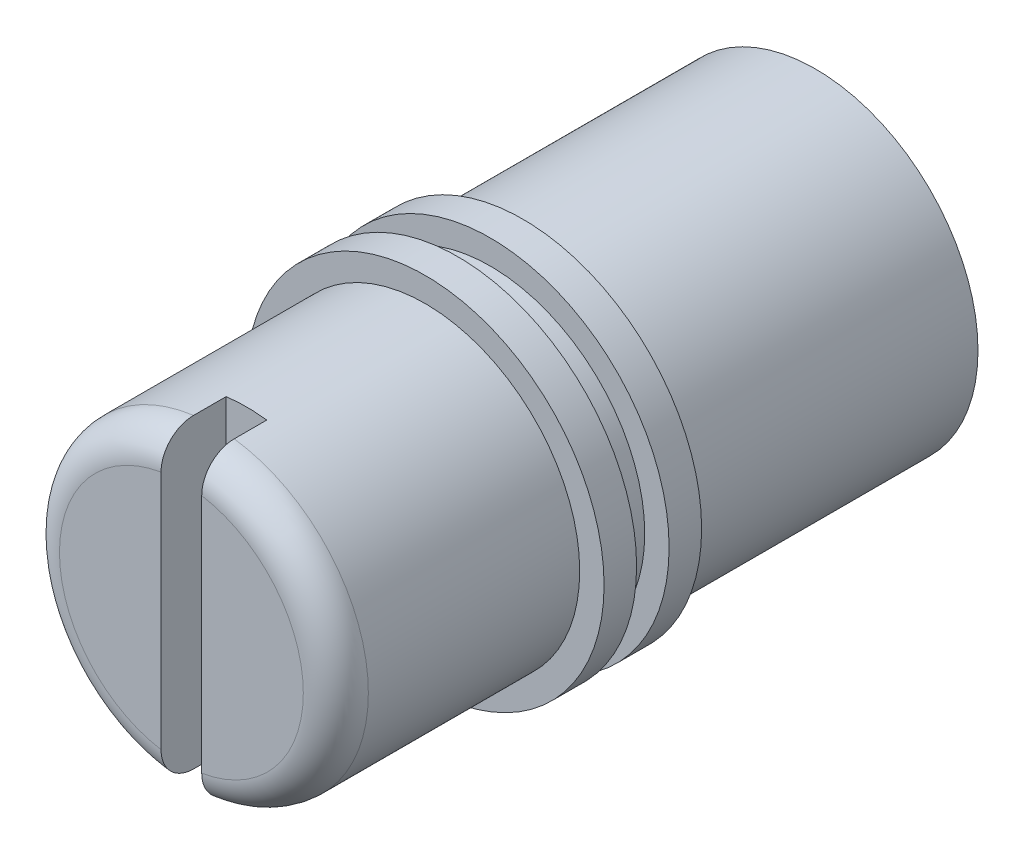
ISO-10303-21;
HEADER;
FILE_DESCRIPTION(('STEP AP214'),'2;1');
FILE_NAME('part.step','',(''),(''),'','','');
FILE_SCHEMA(('AUTOMOTIVE_DESIGN { 1 0 10303 214 1 1 1 1 }'));
ENDSEC;
DATA;
#1=APPLICATION_CONTEXT('core data for automotive mechanical design processes');
#2=APPLICATION_PROTOCOL_DEFINITION('international standard','automotive_design',2000,#1);
#3=PRODUCT_CONTEXT('',#1,'mechanical');
#4=PRODUCT('Part','Part','',(#3));
#5=PRODUCT_RELATED_PRODUCT_CATEGORY('part','',(#4));
#6=PRODUCT_DEFINITION_FORMATION('','',#4);
#7=PRODUCT_DEFINITION_CONTEXT('part definition',#1,'design');
#8=PRODUCT_DEFINITION('design','',#6,#7);
#9=PRODUCT_DEFINITION_SHAPE('','',#8);
#10=(LENGTH_UNIT() NAMED_UNIT(*) SI_UNIT(.MILLI.,.METRE.));
#11=(NAMED_UNIT(*) PLANE_ANGLE_UNIT() SI_UNIT($,.RADIAN.));
#12=(NAMED_UNIT(*) SI_UNIT($,.STERADIAN.) SOLID_ANGLE_UNIT());
#13=UNCERTAINTY_MEASURE_WITH_UNIT(LENGTH_MEASURE(1.E-05),#10,'distance_accuracy_value','');
#14=(GEOMETRIC_REPRESENTATION_CONTEXT(3) GLOBAL_UNCERTAINTY_ASSIGNED_CONTEXT((#13)) GLOBAL_UNIT_ASSIGNED_CONTEXT((#10,
#11,#12)) REPRESENTATION_CONTEXT('',''));
#15=CARTESIAN_POINT('',(0.,0.,0.));
#16=DIRECTION('',(0.,0.,1.));
#17=DIRECTION('',(1.,0.,0.));
#18=AXIS2_PLACEMENT_3D('',#15,#16,#17);
#19=CARTESIAN_POINT('',(0.,0.,19.));
#20=DIRECTION('',(0.,0.,1.));
#21=DIRECTION('',(1.,0.,0.));
#22=AXIS2_PLACEMENT_3D('',#19,#20,#21);
#23=PLANE('',#22);
#24=DIRECTION('',(0.,1.,0.));
#25=VECTOR('',#24,1.);
#26=CARTESIAN_POINT('',(1.25,-9.41740410091868,19.));
#27=LINE('',#26,#25);
#28=CARTESIAN_POINT('',(1.25,-7.39509972887452,19.));
#29=VERTEX_POINT('',#28);
#30=CARTESIAN_POINT('',(1.25,7.39509972887452,19.));
#31=VERTEX_POINT('',#30);
#32=EDGE_CURVE('E118',#29,#31,#27,.T.);
#33=ORIENTED_EDGE('',*,*,#32,.F.);
#34=CARTESIAN_POINT('',(0.,0.,19.));
#35=DIRECTION('',(0.,0.,1.));
#36=DIRECTION('',(1.,0.,0.));
#37=AXIS2_PLACEMENT_3D('',#34,#35,#36);
#38=CIRCLE('',#37,7.5);
#39=EDGE_CURVE('E172',#29,#31,#38,.T.);
#40=ORIENTED_EDGE('',*,*,#39,.T.);
#41=EDGE_LOOP('',(#33,#40));
#42=FACE_BOUND('',#41,.T.);
#43=ADVANCED_FACE('F45',(#42),#23,.T.);
#44=CARTESIAN_POINT('',(0.,0.,17.));
#45=DIRECTION('',(0.,0.,1.));
#46=DIRECTION('',(1.,0.,0.));
#47=AXIS2_PLACEMENT_3D('',#44,#45,#46);
#48=TOROIDAL_SURFACE('',#47,7.5,2.);
#49=CARTESIAN_POINT('',(1.25,-9.04664908810601,18.155258134867));
#50=CARTESIAN_POINT('',(1.25,-8.98093172830162,18.2472460076565));
#51=CARTESIAN_POINT('',(1.25,-8.90733675424601,18.3337135089591));
#52=CARTESIAN_POINT('',(1.25,-8.74657328319224,18.4930938455224));
#53=CARTESIAN_POINT('',(1.25,-8.65938716821143,18.5659888139272));
#54=CARTESIAN_POINT('',(1.25,-8.47411301046072,18.6960803828204));
#55=CARTESIAN_POINT('',(1.25,-8.37603510327227,18.7532914091491));
#56=CARTESIAN_POINT('',(1.25,-8.17175584555951,18.8505660053467));
#57=CARTESIAN_POINT('',(1.25,-8.06555649444125,18.8906337797702));
#58=CARTESIAN_POINT('',(1.25,-7.8471159196168,18.952886446735));
#59=CARTESIAN_POINT('',(1.25,-7.73483294010543,18.9749247825302));
#60=CARTESIAN_POINT('',(1.25,-7.50816237059739,19.0000602973961));
#61=CARTESIAN_POINT('',(1.25,-7.39377456464466,19.0031555219044));
#62=CARTESIAN_POINT('',(1.25,-7.16482038578324,18.9903233976251));
#63=CARTESIAN_POINT('',(1.25,-7.05026561450651,18.9741886850168));
#64=CARTESIAN_POINT('',(1.25,-6.8254466484228,18.9230447427116));
#65=CARTESIAN_POINT('',(1.25,-6.71518268555182,18.888034494229));
#66=CARTESIAN_POINT('',(1.25,-6.501361182468,18.7998275784157));
#67=CARTESIAN_POINT('',(1.25,-6.39785054200579,18.7465171283158));
#68=CARTESIAN_POINT('',(1.25,-6.20129186154907,18.6232053299459));
#69=CARTESIAN_POINT('',(1.25,-6.10824387390797,18.5532038981624));
#70=CARTESIAN_POINT('',(1.25,-5.9357659766892,18.3987427214742));
#71=CARTESIAN_POINT('',(1.25,-5.85627826897539,18.3143475716091));
#72=CARTESIAN_POINT('',(1.25,-5.71290765759123,18.1331991968593));
#73=CARTESIAN_POINT('',(1.25,-5.64902323955097,18.0364471726544));
#74=CARTESIAN_POINT('',(1.25,-5.53996371024852,17.8351609897139));
#75=CARTESIAN_POINT('',(1.25,-5.49447306423277,17.7307978904612));
#76=CARTESIAN_POINT('',(1.25,-5.42213536140043,17.5158003686838));
#77=CARTESIAN_POINT('',(1.25,-5.39528527424443,17.4051669686675));
#78=CARTESIAN_POINT('',(1.25,-5.36157994148869,17.1835306791256));
#79=CARTESIAN_POINT('',(1.25,-5.35427466716089,17.072596085358));
#80=CARTESIAN_POINT('',(1.25,-5.35861531443613,16.8511036212777));
#81=CARTESIAN_POINT('',(1.25,-5.37025976944812,16.7405457224747));
#82=CARTESIAN_POINT('',(1.25,-5.41186577089052,16.5241592644766));
#83=CARTESIAN_POINT('',(1.25,-5.44163196887986,16.4182930121334));
#84=CARTESIAN_POINT('',(1.25,-5.51832130049649,16.2129746784932));
#85=CARTESIAN_POINT('',(1.25,-5.56524527705612,16.1135229126115));
#86=CARTESIAN_POINT('',(1.25,-5.67538800403309,15.9226091243763));
#87=CARTESIAN_POINT('',(1.25,-5.73878367100242,15.8312492643372));
#88=CARTESIAN_POINT('',(1.25,-5.87969082488002,15.6601588923238));
#89=CARTESIAN_POINT('',(1.25,-5.95720391215034,15.5804297006588));
#90=CARTESIAN_POINT('',(1.25,-6.12605730948198,15.4329319963659));
#91=CARTESIAN_POINT('',(1.25,-6.21767412899147,15.3654799764408));
#92=CARTESIAN_POINT('',(1.25,-6.41076735727536,15.2465876676371));
#93=CARTESIAN_POINT('',(1.25,-6.51224476265973,15.195148999442));
#94=CARTESIAN_POINT('',(1.25,-6.72416708152035,15.1088487629196));
#95=CARTESIAN_POINT('',(1.25,-6.83474079043553,15.0743031475377));
#96=CARTESIAN_POINT('',(1.25,-7.0601068444,15.0241580274368));
#97=CARTESIAN_POINT('',(1.25,-7.17489936225265,15.0085592996796));
#98=CARTESIAN_POINT('',(1.25,-7.40606369959346,14.9967625517364));
#99=CARTESIAN_POINT('',(1.25,-7.52244056328628,15.0006627276469));
#100=CARTESIAN_POINT('',(1.25,-7.75286647219451,15.0280647417085));
#101=CARTESIAN_POINT('',(1.25,-7.86691556786574,15.0515661545274));
#102=CARTESIAN_POINT('',(1.25,-8.08871315343761,15.1174003493541));
#103=CARTESIAN_POINT('',(1.25,-8.19649487210649,15.1596211108351));
#104=CARTESIAN_POINT('',(1.25,-8.40332569496314,15.2617535571945));
#105=CARTESIAN_POINT('',(1.25,-8.50237525497466,15.3216643179339));
#106=CARTESIAN_POINT('',(1.25,-8.68777505066659,15.4567814748473));
#107=CARTESIAN_POINT('',(1.25,-8.77425172250068,15.5318143745134));
#108=CARTESIAN_POINT('',(1.25,-8.93320844101848,15.6954766645595));
#109=CARTESIAN_POINT('',(1.25,-9.00568929518517,15.784105270011));
#110=CARTESIAN_POINT('',(1.25,-9.13377696044264,15.9714059655306));
#111=CARTESIAN_POINT('',(1.25,-9.18955775838269,16.0699590910185));
#112=CARTESIAN_POINT('',(1.25,-9.28362684527791,16.2750827795306));
#113=CARTESIAN_POINT('',(1.25,-9.32191666524692,16.3816526398855));
#114=CARTESIAN_POINT('',(1.25,-9.37962592169814,16.5988665056513));
#115=CARTESIAN_POINT('',(1.25,-9.39919423910013,16.7094709807697));
#116=CARTESIAN_POINT('',(1.25,-9.41941099859594,16.9324259897071));
#117=CARTESIAN_POINT('',(1.25,-9.42005514052417,17.0447769145714));
#118=CARTESIAN_POINT('',(1.25,-9.40242919940757,17.267607470661));
#119=CARTESIAN_POINT('',(1.25,-9.38422003609745,17.3780919639246));
#120=CARTESIAN_POINT('',(1.25,-9.32952587826011,17.5943397566418));
#121=CARTESIAN_POINT('',(1.25,-9.29306346031533,17.7001087129524));
#122=CARTESIAN_POINT('',(1.25,-9.22061942769984,17.8641322566973));
#123=CARTESIAN_POINT('',(1.25,-9.19000689817255,17.9248166366184));
#124=CARTESIAN_POINT('',(1.25,-9.12276013648806,18.0427507206054));
#125=CARTESIAN_POINT('',(1.25,-9.08612592343863,18.1000004355692));
#126=CARTESIAN_POINT('',(1.25,-9.04664908810601,18.155258134867));
#127=B_SPLINE_CURVE_WITH_KNOTS('',3,(#49,#50,#51,#52,#53,#54,#55,#56,#57,#58,#59,#60,#61,#62,
#63,#64,#65,#66,#67,#68,#69,#70,#71,#72,#73,#74,#75,#76,#77,#78,#79,#80,#81,#82,#83,#84,#85,#86,
#87,#88,#89,#90,#91,#92,#93,#94,#95,#96,#97,#98,#99,#100,#101,#102,#103,#104,#105,#106,#107,
#108,#109,#110,#111,#112,#113,#114,#115,#116,#117,#118,#119,#120,#121,#122,#123,#124,#125,#126),
.UNSPECIFIED.,.T.,.F.,(4,2,2,2,2,2,2,2,2,2,2,2,2,2,2,2,2,2,2,2,2,2,2,2,2,2,2,2,2,2,2,2,2,2,2,2,
2,2,4),(0.,0.338902148739581,0.67824732127074,1.01727931422795,1.35622810845693,
1.69790549636849,2.03961813817965,2.38504918325568,2.73049887444831,3.07813653861252,
3.42577594222186,3.77189442232045,4.11797929669302,4.4578459088352,4.79765725694145,
5.12957410319627,5.46146526237564,5.78984054031466,6.11823195293831,6.45030783908038,
6.78242139306759,7.12215698616986,7.46192695215374,7.80782935031775,8.15374593254628,
8.50140629335011,8.84905911037985,9.19465900440553,9.54024084722132,9.88206300745838,
10.2238654405094,10.5619719113039,10.900048781414,11.2354142146416,11.5708558528136,
11.9052169678543,12.2391655455459,12.4427468642696,12.6463275370094),.UNSPECIFIED.);
#128=CARTESIAN_POINT('',(1.25,-9.41740410091868,17.));
#129=VERTEX_POINT('',#128);
#130=EDGE_CURVE('E11',#129,#29,#127,.T.);
#131=ORIENTED_EDGE('',*,*,#130,.F.);
#132=CARTESIAN_POINT('',(0.,0.,17.));
#133=DIRECTION('',(0.,0.,1.));
#134=DIRECTION('',(1.,0.,0.));
#135=AXIS2_PLACEMENT_3D('',#132,#133,#134);
#136=CIRCLE('',#135,9.5);
#137=CARTESIAN_POINT('',(1.25,9.41740410091868,17.));
#138=VERTEX_POINT('',#137);
#139=EDGE_CURVE('E177',#138,#129,#136,.F.);
#140=ORIENTED_EDGE('',*,*,#139,.F.);
#141=CARTESIAN_POINT('',(1.25,5.55984293893053,17.8689398843067));
#142=CARTESIAN_POINT('',(1.25,5.61015144852526,17.9706806387738));
#143=CARTESIAN_POINT('',(1.25,5.66924840118999,18.0681803413833));
#144=CARTESIAN_POINT('',(1.25,5.80310528793279,18.2518959953369));
#145=CARTESIAN_POINT('',(1.25,5.87788845789628,18.338094895576));
#146=CARTESIAN_POINT('',(1.25,6.04068321464192,18.4966902948045));
#147=CARTESIAN_POINT('',(1.25,6.12867626562556,18.569105816433));
#148=CARTESIAN_POINT('',(1.25,6.31538884745695,18.6983686078277));
#149=CARTESIAN_POINT('',(1.25,6.4141055200743,18.7552200118387));
#150=CARTESIAN_POINT('',(1.25,6.62104635391127,18.8526211519308));
#151=CARTESIAN_POINT('',(1.25,6.72938819056522,18.8929210131031));
#152=CARTESIAN_POINT('',(1.25,6.95127957045933,18.9549126880543));
#153=CARTESIAN_POINT('',(1.25,7.06482962433838,18.9766026731045));
#154=CARTESIAN_POINT('',(1.25,7.29478882675318,19.0008211943336));
#155=CARTESIAN_POINT('',(1.25,7.41121267761593,19.0032105914684));
#156=CARTESIAN_POINT('',(1.25,7.64279862252071,18.9883183881906));
#157=CARTESIAN_POINT('',(1.25,7.75796073410363,18.9710370615945));
#158=CARTESIAN_POINT('',(1.25,7.98318112492996,18.9173237284002));
#159=CARTESIAN_POINT('',(1.25,8.09326017132482,18.8809788766639));
#160=CARTESIAN_POINT('',(1.25,8.30565392314418,18.7901307469127));
#161=CARTESIAN_POINT('',(1.25,8.40796904319875,18.7356284394302));
#162=CARTESIAN_POINT('',(1.25,8.60077924199814,18.6106155459844));
#163=CARTESIAN_POINT('',(1.25,8.69138689602422,18.5402786038901));
#164=CARTESIAN_POINT('',(1.25,8.85933939810479,18.3852350362491));
#165=CARTESIAN_POINT('',(1.25,8.93668502611996,18.3005292563397));
#166=CARTESIAN_POINT('',(1.25,9.07501638234029,18.1201681803661));
#167=CARTESIAN_POINT('',(1.25,9.13617395742325,18.0246446693298));
#168=CARTESIAN_POINT('',(1.25,9.24142337380422,17.8246176627828));
#169=CARTESIAN_POINT('',(1.25,9.28551607932205,17.7201146223519));
#170=CARTESIAN_POINT('',(1.25,9.35501428477004,17.5060533973718));
#171=CARTESIAN_POINT('',(1.25,9.38057540100308,17.3965457169454));
#172=CARTESIAN_POINT('',(1.25,9.41285918941374,17.1747885502003));
#173=CARTESIAN_POINT('',(1.25,9.41958243688374,17.0625391477172));
#174=CARTESIAN_POINT('',(1.25,9.41400349807255,16.8390134693709));
#175=CARTESIAN_POINT('',(1.25,9.40178533564099,16.7277350853021));
#176=CARTESIAN_POINT('',(1.25,9.35884166107459,16.5088104866349));
#177=CARTESIAN_POINT('',(1.25,9.32811629621285,16.4011642431406));
#178=CARTESIAN_POINT('',(1.25,9.2490570801149,16.1925275226135));
#179=CARTESIAN_POINT('',(1.25,9.20072036924745,16.0915381296293));
#180=CARTESIAN_POINT('',(1.25,9.08785381567853,15.8990576437733));
#181=CARTESIAN_POINT('',(1.25,9.02332372377377,15.8075666971057));
#182=CARTESIAN_POINT('',(1.25,8.87960126952886,15.6362019006753));
#183=CARTESIAN_POINT('',(1.25,8.80034154775554,15.5563845588965));
#184=CARTESIAN_POINT('',(1.25,8.62964758754415,15.4110535636598));
#185=CARTESIAN_POINT('',(1.25,8.53821289786071,15.3455404406021));
#186=CARTESIAN_POINT('',(1.25,8.34493341622261,15.2300580117029));
#187=CARTESIAN_POINT('',(1.25,8.24300574135702,15.1802274516952));
#188=CARTESIAN_POINT('',(1.25,8.03229563219479,15.0981754511769));
#189=CARTESIAN_POINT('',(1.25,7.92351281693563,15.0659549902814));
#190=CARTESIAN_POINT('',(1.25,7.70089973900283,15.0196592849016));
#191=CARTESIAN_POINT('',(1.25,7.58702703274839,15.0057881366748));
#192=CARTESIAN_POINT('',(1.25,7.35855929592549,14.9971480865757));
#193=CARTESIAN_POINT('',(1.25,7.24396422073139,15.0023803766296));
#194=CARTESIAN_POINT('',(1.25,7.01604212953403,15.0318930856472));
#195=CARTESIAN_POINT('',(1.25,6.90274059735973,15.0563705274503));
#196=CARTESIAN_POINT('',(1.25,6.68181360810447,15.1239082971533));
#197=CARTESIAN_POINT('',(1.25,6.57418844438509,15.1669695844348));
#198=CARTESIAN_POINT('',(1.25,6.36719196484646,15.2707366052778));
#199=CARTESIAN_POINT('',(1.25,6.26786015654822,15.3315212144146));
#200=CARTESIAN_POINT('',(1.25,6.08090033263828,15.4690180456167));
#201=CARTESIAN_POINT('',(1.25,5.99327219916886,15.5457301072704));
#202=CARTESIAN_POINT('',(1.25,5.83298066764093,15.712378015008));
#203=CARTESIAN_POINT('',(1.25,5.76021214634013,15.8022126623509));
#204=CARTESIAN_POINT('',(1.25,5.63116161874592,15.9930316133278));
#205=CARTESIAN_POINT('',(1.25,5.57487693401569,16.0940141018879));
#206=CARTESIAN_POINT('',(1.25,5.48165650197311,16.302073488244));
#207=CARTESIAN_POINT('',(1.25,5.44434910886573,16.4089838249687));
#208=CARTESIAN_POINT('',(1.25,5.38866344822197,16.6276555466492));
#209=CARTESIAN_POINT('',(1.25,5.37028717251242,16.7394174407699));
#210=CARTESIAN_POINT('',(1.25,5.35331461873287,16.9619897330401));
#211=CARTESIAN_POINT('',(1.25,5.35430038440092,17.0727686863209));
#212=CARTESIAN_POINT('',(1.25,5.3749996715628,17.2924624316921));
#213=CARTESIAN_POINT('',(1.25,5.39468881968732,17.4013794621313));
#214=CARTESIAN_POINT('',(1.25,5.44011237810177,17.5700397911123));
#215=CARTESIAN_POINT('',(1.25,5.45994851810567,17.6314346725764));
#216=CARTESIAN_POINT('',(1.25,5.50552564471524,17.7519890889681));
#217=CARTESIAN_POINT('',(1.25,5.53126648987385,17.8111486774027));
#218=CARTESIAN_POINT('',(1.25,5.55984293893053,17.8689398843067));
#219=B_SPLINE_CURVE_WITH_KNOTS('',3,(#141,#142,#143,#144,#145,#146,#147,#148,#149,#150,#151,
#152,#153,#154,#155,#156,#157,#158,#159,#160,#161,#162,#163,#164,#165,#166,#167,#168,#169,#170,
#171,#172,#173,#174,#175,#176,#177,#178,#179,#180,#181,#182,#183,#184,#185,#186,#187,#188,#189,
#190,#191,#192,#193,#194,#195,#196,#197,#198,#199,#200,#201,#202,#203,#204,#205,#206,#207,#208,
#209,#210,#211,#212,#213,#214,#215,#216,#217,#218),.UNSPECIFIED.,.T.,.F.,(4,2,2,2,2,2,2,2,2,2,2,
2,2,2,2,2,2,2,2,2,2,2,2,2,2,2,2,2,2,2,2,2,2,2,2,2,2,2,4),(0.,0.340256385407494,
0.681020395348954,1.02131064667565,1.36151041993966,1.70667241462045,2.05186832330097,
2.3995505678874,2.74722797279316,3.0933295409353,3.43941261260356,3.78187093121677,
4.12430910240242,4.46295131361893,4.80157637266142,5.13732385959273,5.47306109297125,
5.80731325643285,6.14156276008135,6.47586656148786,6.81017550787993,7.14605266753195,
7.48194227939139,7.82072504800352,8.15952666051196,8.50206587559499,8.84462646318858,
9.19074042430458,9.53687225551599,9.88456865149879,10.2322615458643,10.5774022955184,
10.9224869325528,11.2605247413714,11.5985981130162,11.9293818852288,12.2597351860656,
12.453013664105,12.6462875126475),.UNSPECIFIED.);
#220=EDGE_CURVE('E59',#31,#138,#219,.T.);
#221=ORIENTED_EDGE('',*,*,#220,.F.);
#222=ORIENTED_EDGE('',*,*,#39,.F.);
#223=EDGE_LOOP('',(#131,#140,#221,#222));
#224=FACE_BOUND('',#223,.T.);
#225=ADVANCED_FACE('F240',(#224),#48,.T.);
#226=CARTESIAN_POINT('',(0.,0.,19.));
#227=DIRECTION('',(0.,0.,-1.));
#228=DIRECTION('',(-1.,0.,0.));
#229=AXIS2_PLACEMENT_3D('',#226,#227,#228);
#230=CYLINDRICAL_SURFACE('',#229,9.5);
#231=CARTESIAN_POINT('',(0.,0.,0.));
#232=DIRECTION('',(0.,0.,1.));
#233=DIRECTION('',(1.,0.,0.));
#234=AXIS2_PLACEMENT_3D('',#231,#232,#233);
#235=CIRCLE('',#234,9.5);
#236=CARTESIAN_POINT('',(9.5,0.,0.));
#237=VERTEX_POINT('',#236);
#238=EDGE_CURVE('E164',#237,#237,#235,.T.);
#239=ORIENTED_EDGE('',*,*,#238,.T.);
#240=EDGE_LOOP('',(#239));
#241=FACE_BOUND('',#240,.T.);
#242=CARTESIAN_POINT('',(0.,0.,2.));
#243=DIRECTION('',(0.,0.,1.));
#244=DIRECTION('',(1.,0.,0.));
#245=AXIS2_PLACEMENT_3D('',#242,#243,#244);
#246=CIRCLE('',#245,9.5);
#247=CARTESIAN_POINT('',(9.5,0.,2.));
#248=VERTEX_POINT('',#247);
#249=EDGE_CURVE('E168',#248,#248,#246,.T.);
#250=ORIENTED_EDGE('',*,*,#249,.F.);
#251=EDGE_LOOP('',(#250));
#252=FACE_BOUND('',#251,.T.);
#253=ADVANCED_FACE('F228',(#241,#252),#230,.T.);
#254=CARTESIAN_POINT('',(0.,0.,0.));
#255=DIRECTION('',(0.,0.,1.));
#256=DIRECTION('',(1.,0.,0.));
#257=AXIS2_PLACEMENT_3D('',#254,#255,#256);
#258=PLANE('',#257);
#259=ORIENTED_EDGE('',*,*,#238,.F.);
#260=EDGE_LOOP('',(#259));
#261=FACE_BOUND('',#260,.T.);
#262=CARTESIAN_POINT('',(0.,0.,0.));
#263=DIRECTION('',(0.,0.,1.));
#264=DIRECTION('',(1.,0.,0.));
#265=AXIS2_PLACEMENT_3D('',#262,#263,#264);
#266=CIRCLE('',#265,11.);
#267=CARTESIAN_POINT('',(11.,0.,0.));
#268=VERTEX_POINT('',#267);
#269=EDGE_CURVE('E140',#268,#268,#266,.T.);
#270=ORIENTED_EDGE('',*,*,#269,.T.);
#271=EDGE_LOOP('',(#270));
#272=FACE_BOUND('',#271,.T.);
#273=ADVANCED_FACE('F220',(#261,#272),#258,.T.);
#274=CARTESIAN_POINT('',(0.,0.,4.));
#275=DIRECTION('',(0.,0.,-1.));
#276=DIRECTION('',(-1.,0.,0.));
#277=AXIS2_PLACEMENT_3D('',#274,#275,#276);
#278=CYLINDRICAL_SURFACE('',#277,11.);
#279=CARTESIAN_POINT('',(0.,0.,4.));
#280=DIRECTION('',(0.,0.,1.));
#281=DIRECTION('',(1.,0.,0.));
#282=AXIS2_PLACEMENT_3D('',#279,#280,#281);
#283=CIRCLE('',#282,11.);
#284=CARTESIAN_POINT('',(11.,0.,4.));
#285=VERTEX_POINT('',#284);
#286=EDGE_CURVE('E149',#285,#285,#283,.T.);
#287=ORIENTED_EDGE('',*,*,#286,.F.);
#288=EDGE_LOOP('',(#287));
#289=FACE_BOUND('',#288,.T.);
#290=CARTESIAN_POINT('',(0.,0.,2.));
#291=DIRECTION('',(0.,0.,1.));
#292=DIRECTION('',(1.,0.,0.));
#293=AXIS2_PLACEMENT_3D('',#290,#291,#292);
#294=CIRCLE('',#293,11.);
#295=CARTESIAN_POINT('',(11.,0.,2.));
#296=VERTEX_POINT('',#295);
#297=EDGE_CURVE('E144',#296,#296,#294,.T.);
#298=ORIENTED_EDGE('',*,*,#297,.T.);
#299=EDGE_LOOP('',(#298));
#300=FACE_BOUND('',#299,.T.);
#301=ADVANCED_FACE('F212',(#289,#300),#278,.T.);
#302=CARTESIAN_POINT('',(0.,0.,4.));
#303=DIRECTION('',(0.,0.,1.));
#304=DIRECTION('',(1.,0.,0.));
#305=AXIS2_PLACEMENT_3D('',#302,#303,#304);
#306=PLANE('',#305);
#307=ORIENTED_EDGE('',*,*,#286,.T.);
#308=EDGE_LOOP('',(#307));
#309=FACE_BOUND('',#308,.T.);
#310=CARTESIAN_POINT('',(0.,0.,4.));
#311=DIRECTION('',(0.,0.,1.));
#312=DIRECTION('',(1.,0.,0.));
#313=AXIS2_PLACEMENT_3D('',#310,#311,#312);
#314=CIRCLE('',#313,9.5);
#315=CARTESIAN_POINT('',(9.5,0.,4.));
#316=VERTEX_POINT('',#315);
#317=EDGE_CURVE('E153',#316,#316,#314,.T.);
#318=ORIENTED_EDGE('',*,*,#317,.F.);
#319=EDGE_LOOP('',(#318));
#320=FACE_BOUND('',#319,.T.);
#321=ADVANCED_FACE('F208',(#309,#320),#306,.T.);
#322=CARTESIAN_POINT('',(0.,0.,2.));
#323=DIRECTION('',(0.,0.,1.));
#324=DIRECTION('',(1.,0.,0.));
#325=AXIS2_PLACEMENT_3D('',#322,#323,#324);
#326=PLANE('',#325);
#327=ORIENTED_EDGE('',*,*,#297,.F.);
#328=EDGE_LOOP('',(#327));
#329=FACE_BOUND('',#328,.T.);
#330=ORIENTED_EDGE('',*,*,#249,.T.);
#331=EDGE_LOOP('',(#330));
#332=FACE_BOUND('',#331,.T.);
#333=ADVANCED_FACE('F211',(#329,#332),#326,.F.);
#334=DIRECTION('',(0.,-1.,0.));
#335=VECTOR('',#334,1.);
#336=CARTESIAN_POINT('',(-1.25,-9.41740410091868,19.));
#337=LINE('',#336,#335);
#338=CARTESIAN_POINT('',(-1.25,7.39509972887452,19.));
#339=VERTEX_POINT('',#338);
#340=CARTESIAN_POINT('',(-1.25,-7.39509972887452,19.));
#341=VERTEX_POINT('',#340);
#342=EDGE_CURVE('E251',#339,#341,#337,.T.);
#343=ORIENTED_EDGE('',*,*,#342,.F.);
#344=EDGE_CURVE('E176',#339,#341,#38,.T.);
#345=ORIENTED_EDGE('',*,*,#344,.T.);
#346=EDGE_LOOP('',(#343,#345));
#347=FACE_BOUND('',#346,.T.);
#348=ADVANCED_FACE('F216',(#347),#23,.T.);
#349=CARTESIAN_POINT('',(0.,0.,15.));
#350=DIRECTION('',(0.,0.,1.));
#351=DIRECTION('',(1.,0.,0.));
#352=AXIS2_PLACEMENT_3D('',#349,#350,#351);
#353=CIRCLE('',#352,9.5);
#354=CARTESIAN_POINT('',(1.25,9.41740410091868,15.));
#355=VERTEX_POINT('',#354);
#356=CARTESIAN_POINT('',(-1.25,9.41740410091868,15.));
#357=VERTEX_POINT('',#356);
#358=EDGE_CURVE('E109',#355,#357,#353,.T.);
#359=ORIENTED_EDGE('',*,*,#358,.F.);
#360=DIRECTION('',(0.,0.,1.));
#361=VECTOR('',#360,1.);
#362=CARTESIAN_POINT('',(1.25,9.41740410091868,15.));
#363=LINE('',#362,#361);
#364=EDGE_CURVE('E148',#355,#138,#363,.T.);
#365=ORIENTED_EDGE('',*,*,#364,.T.);
#366=ORIENTED_EDGE('',*,*,#139,.T.);
#367=DIRECTION('',(0.,0.,1.));
#368=VECTOR('',#367,1.);
#369=CARTESIAN_POINT('',(1.25,-9.41740410091868,15.));
#370=LINE('',#369,#368);
#371=CARTESIAN_POINT('',(1.25,-9.41740410091868,15.));
#372=VERTEX_POINT('',#371);
#373=EDGE_CURVE('E130',#372,#129,#370,.T.);
#374=ORIENTED_EDGE('',*,*,#373,.F.);
#375=CARTESIAN_POINT('',(0.,0.,15.));
#376=DIRECTION('',(0.,0.,1.));
#377=DIRECTION('',(1.,0.,0.));
#378=AXIS2_PLACEMENT_3D('',#375,#376,#377);
#379=CIRCLE('',#378,9.5);
#380=CARTESIAN_POINT('',(-1.25,-9.41740410091868,15.));
#381=VERTEX_POINT('',#380);
#382=EDGE_CURVE('E108',#381,#372,#379,.T.);
#383=ORIENTED_EDGE('',*,*,#382,.F.);
#384=DIRECTION('',(0.,0.,1.));
#385=VECTOR('',#384,1.);
#386=CARTESIAN_POINT('',(-1.25,-9.41740410091868,15.));
#387=LINE('',#386,#385);
#388=CARTESIAN_POINT('',(-1.25,-9.41740410091868,17.));
#389=VERTEX_POINT('',#388);
#390=EDGE_CURVE('E104',#381,#389,#387,.T.);
#391=ORIENTED_EDGE('',*,*,#390,.T.);
#392=CARTESIAN_POINT('',(-1.25,9.41740410091868,17.));
#393=VERTEX_POINT('',#392);
#394=EDGE_CURVE('E124',#389,#393,#136,.F.);
#395=ORIENTED_EDGE('',*,*,#394,.T.);
#396=DIRECTION('',(0.,0.,1.));
#397=VECTOR('',#396,1.);
#398=CARTESIAN_POINT('',(-1.25,9.41740410091868,15.));
#399=LINE('',#398,#397);
#400=EDGE_CURVE('E66',#357,#393,#399,.T.);
#401=ORIENTED_EDGE('',*,*,#400,.F.);
#402=EDGE_LOOP('',(#359,#365,#366,#374,#383,#391,#395,#401));
#403=FACE_BOUND('',#402,.T.);
#404=ORIENTED_EDGE('',*,*,#317,.T.);
#405=EDGE_LOOP('',(#404));
#406=FACE_BOUND('',#405,.T.);
#407=ADVANCED_FACE('F121',(#403,#406),#230,.T.);
#408=CARTESIAN_POINT('',(0.,0.,-2.));
#409=DIRECTION('',(0.,0.,1.));
#410=DIRECTION('',(1.,0.,0.));
#411=AXIS2_PLACEMENT_3D('',#408,#409,#410);
#412=CYLINDRICAL_SURFACE('',#411,11.);
#413=CARTESIAN_POINT('',(0.,0.,-2.));
#414=DIRECTION('',(0.,0.,1.));
#415=DIRECTION('',(1.,0.,0.));
#416=AXIS2_PLACEMENT_3D('',#413,#414,#415);
#417=CIRCLE('',#416,11.);
#418=CARTESIAN_POINT('',(11.,0.,-2.));
#419=VERTEX_POINT('',#418);
#420=EDGE_CURVE('E139',#419,#419,#417,.T.);
#421=ORIENTED_EDGE('',*,*,#420,.T.);
#422=EDGE_LOOP('',(#421));
#423=FACE_BOUND('',#422,.T.);
#424=ORIENTED_EDGE('',*,*,#269,.F.);
#425=EDGE_LOOP('',(#424));
#426=FACE_BOUND('',#425,.T.);
#427=ADVANCED_FACE('F203',(#423,#426),#412,.T.);
#428=CARTESIAN_POINT('',(0.,0.,-2.));
#429=DIRECTION('',(0.,0.,1.));
#430=DIRECTION('',(1.,0.,0.));
#431=AXIS2_PLACEMENT_3D('',#428,#429,#430);
#432=PLANE('',#431);
#433=CARTESIAN_POINT('',(0.,0.,-2.));
#434=DIRECTION('',(0.,0.,1.));
#435=DIRECTION('',(1.,0.,0.));
#436=AXIS2_PLACEMENT_3D('',#433,#434,#435);
#437=CIRCLE('',#436,10.);
#438=CARTESIAN_POINT('',(10.,0.,-2.));
#439=VERTEX_POINT('',#438);
#440=EDGE_CURVE('E135',#439,#439,#437,.T.);
#441=ORIENTED_EDGE('',*,*,#440,.T.);
#442=EDGE_LOOP('',(#441));
#443=FACE_BOUND('',#442,.T.);
#444=ORIENTED_EDGE('',*,*,#420,.F.);
#445=EDGE_LOOP('',(#444));
#446=FACE_BOUND('',#445,.T.);
#447=ADVANCED_FACE('F198',(#443,#446),#432,.F.);
#448=CARTESIAN_POINT('',(0.,0.,-20.));
#449=DIRECTION('',(0.,0.,1.));
#450=DIRECTION('',(1.,0.,0.));
#451=AXIS2_PLACEMENT_3D('',#448,#449,#450);
#452=PLANE('',#451);
#453=CARTESIAN_POINT('',(0.,0.,-20.));
#454=DIRECTION('',(0.,0.,-1.));
#455=DIRECTION('',(-1.,0.,0.));
#456=AXIS2_PLACEMENT_3D('',#453,#454,#455);
#457=CIRCLE('',#456,5.);
#458=CARTESIAN_POINT('',(-5.,0.,-20.));
#459=VERTEX_POINT('',#458);
#460=EDGE_CURVE('E296',#459,#459,#457,.T.);
#461=ORIENTED_EDGE('',*,*,#460,.F.);
#462=EDGE_LOOP('',(#461));
#463=FACE_BOUND('',#462,.T.);
#464=CARTESIAN_POINT('',(0.,0.,-20.));
#465=DIRECTION('',(0.,0.,1.));
#466=DIRECTION('',(1.,0.,0.));
#467=AXIS2_PLACEMENT_3D('',#464,#465,#466);
#468=CIRCLE('',#467,10.);
#469=CARTESIAN_POINT('',(10.,0.,-20.));
#470=VERTEX_POINT('',#469);
#471=EDGE_CURVE('E157',#470,#470,#468,.T.);
#472=ORIENTED_EDGE('',*,*,#471,.F.);
#473=EDGE_LOOP('',(#472));
#474=FACE_BOUND('',#473,.T.);
#475=ADVANCED_FACE('F202',(#463,#474),#452,.F.);
#476=CARTESIAN_POINT('',(0.,0.,-20.));
#477=DIRECTION('',(0.,0.,1.));
#478=DIRECTION('',(1.,0.,0.));
#479=AXIS2_PLACEMENT_3D('',#476,#477,#478);
#480=CYLINDRICAL_SURFACE('',#479,10.);
#481=ORIENTED_EDGE('',*,*,#471,.T.);
#482=EDGE_LOOP('',(#481));
#483=FACE_BOUND('',#482,.T.);
#484=ORIENTED_EDGE('',*,*,#440,.F.);
#485=EDGE_LOOP('',(#484));
#486=FACE_BOUND('',#485,.T.);
#487=ADVANCED_FACE('F224',(#483,#486),#480,.T.);
#488=CARTESIAN_POINT('',(-1.25,-9.04664908810601,18.155258134867));
#489=CARTESIAN_POINT('',(-1.25,-9.11157955915854,18.0643543440379));
#490=CARTESIAN_POINT('',(-1.25,-9.16891285493386,17.9679289241763));
#491=CARTESIAN_POINT('',(-1.25,-9.2666376033253,17.7667497904548));
#492=CARTESIAN_POINT('',(-1.25,-9.30701014328671,17.6619869336111));
#493=CARTESIAN_POINT('',(-1.25,-9.3695535171072,17.4471810015685));
#494=CARTESIAN_POINT('',(-1.25,-9.39172930339515,17.3371393716762));
#495=CARTESIAN_POINT('',(-1.25,-9.41722695399737,17.1149206486412));
#496=CARTESIAN_POINT('',(-1.25,-9.42055325771361,17.0027440645651));
#497=CARTESIAN_POINT('',(-1.25,-9.40828393994103,16.7797297352252));
#498=CARTESIAN_POINT('',(-1.25,-9.39273844198024,16.6688892296497));
#499=CARTESIAN_POINT('',(-1.25,-9.34326801211522,16.4513868287337));
#500=CARTESIAN_POINT('',(-1.25,-9.30934254366598,16.3447250554755));
#501=CARTESIAN_POINT('',(-1.25,-9.22408627435703,16.1385335123235));
#502=CARTESIAN_POINT('',(-1.25,-9.1727457591278,16.0390077606245));
#503=CARTESIAN_POINT('',(-1.25,-9.05416459764994,15.8499315273742));
#504=CARTESIAN_POINT('',(-1.25,-8.98692370040885,15.7603812033209));
#505=CARTESIAN_POINT('',(-1.25,-8.83810735219921,15.5932921420316));
#506=CARTESIAN_POINT('',(-1.25,-8.75646088678264,15.5158166685271));
#507=CARTESIAN_POINT('',(-1.25,-8.58141985385859,15.3755291098495));
#508=CARTESIAN_POINT('',(-1.25,-8.48802484822642,15.3127175717712));
#509=CARTESIAN_POINT('',(-1.25,-8.29125830958121,15.2029272359355));
#510=CARTESIAN_POINT('',(-1.25,-8.18780532479125,15.1560944441546));
#511=CARTESIAN_POINT('',(-1.25,-7.97456367460523,15.0802474186138));
#512=CARTESIAN_POINT('',(-1.25,-7.8647746456527,15.0512342084395));
#513=CARTESIAN_POINT('',(-1.25,-7.64067361361727,15.01150875919));
#514=CARTESIAN_POINT('',(-1.25,-7.52632487800347,15.0010037324973));
#515=CARTESIAN_POINT('',(-1.25,-7.29747067139993,14.9991334465405));
#516=CARTESIAN_POINT('',(-1.25,-7.18296519097985,15.0077693944498));
#517=CARTESIAN_POINT('',(-1.25,-6.95582222730213,15.0440692714976));
#518=CARTESIAN_POINT('',(-1.25,-6.84321527055692,15.0719244077513));
#519=CARTESIAN_POINT('',(-1.25,-6.62423834647101,15.1460695259115));
#520=CARTESIAN_POINT('',(-1.25,-6.51786867065897,15.1923603687107));
#521=CARTESIAN_POINT('',(-1.25,-6.31401240320812,15.3023240104166));
#522=CARTESIAN_POINT('',(-1.25,-6.21656008952824,15.3660604083906));
#523=CARTESIAN_POINT('',(-1.25,-6.03384969737371,15.50911993463));
#524=CARTESIAN_POINT('',(-1.25,-5.94859136901635,15.588442743415));
#525=CARTESIAN_POINT('',(-1.25,-5.79356046722619,15.7597658239455));
#526=CARTESIAN_POINT('',(-1.25,-5.72366092071233,15.8516511013287));
#527=CARTESIAN_POINT('',(-1.25,-5.60067121959439,16.0460603263183));
#528=CARTESIAN_POINT('',(-1.25,-5.54757887458418,16.1485828853021));
#529=CARTESIAN_POINT('',(-1.25,-5.46094035518772,16.3590493581768));
#530=CARTESIAN_POINT('',(-1.25,-5.42700504424996,16.46683304044));
#531=CARTESIAN_POINT('',(-1.25,-5.37815701038045,16.6866248929787));
#532=CARTESIAN_POINT('',(-1.25,-5.36324141977705,16.7986324237868));
#533=CARTESIAN_POINT('',(-1.25,-5.35307204955553,17.0211374278613));
#534=CARTESIAN_POINT('',(-1.25,-5.3574063605722,17.1316162692487));
#535=CARTESIAN_POINT('',(-1.25,-5.38464790502209,17.350254156298));
#536=CARTESIAN_POINT('',(-1.25,-5.4075544806251,17.458413283985));
#537=CARTESIAN_POINT('',(-1.25,-5.47103130138112,17.6689375595742));
#538=CARTESIAN_POINT('',(-1.25,-5.51153121733863,17.7713239615742));
#539=CARTESIAN_POINT('',(-1.25,-5.60887113269306,17.9680041888129));
#540=CARTESIAN_POINT('',(-1.25,-5.66571237515769,18.062297397702));
#541=CARTESIAN_POINT('',(-1.25,-5.79507301659251,18.2418231308653));
#542=CARTESIAN_POINT('',(-1.25,-5.8678367048476,18.3268795338339));
#543=CARTESIAN_POINT('',(-1.25,-6.02631900778248,18.4839158409176));
#544=CARTESIAN_POINT('',(-1.25,-6.11203916445414,18.5558941863219));
#545=CARTESIAN_POINT('',(-1.25,-6.29613470701517,18.6864487165249));
#546=CARTESIAN_POINT('',(-1.25,-6.39475586610432,18.7446784812864));
#547=CARTESIAN_POINT('',(-1.25,-6.60027030061432,18.8440308525192));
#548=CARTESIAN_POINT('',(-1.25,-6.70716429778355,18.8851519643779));
#549=CARTESIAN_POINT('',(-1.25,-6.92785687941054,18.9496462661075));
#550=CARTESIAN_POINT('',(-1.25,-7.04173266680586,18.9727556438202));
#551=CARTESIAN_POINT('',(-1.25,-7.27174571944279,18.9995552776727));
#552=CARTESIAN_POINT('',(-1.25,-7.38788294297258,19.0032458916488));
#553=CARTESIAN_POINT('',(-1.25,-7.61924867368192,18.9910286710033));
#554=CARTESIAN_POINT('',(-1.25,-7.7344761047846,18.9751003580427));
#555=CARTESIAN_POINT('',(-1.25,-7.96060483317804,18.9239580947238));
#556=CARTESIAN_POINT('',(-1.25,-8.07150519955523,18.8887400186561));
#557=CARTESIAN_POINT('',(-1.25,-8.28487021334418,18.8002796409111));
#558=CARTESIAN_POINT('',(-1.25,-8.38739256635399,18.7471763568271));
#559=CARTESIAN_POINT('',(-1.25,-8.58183023137114,18.6243533218298));
#560=CARTESIAN_POINT('',(-1.25,-8.67375882467462,18.5546547201588));
#561=CARTESIAN_POINT('',(-1.25,-8.812583116448,18.4293190403339));
#562=CARTESIAN_POINT('',(-1.25,-8.86351896647223,18.3780810898681));
#563=CARTESIAN_POINT('',(-1.25,-8.95957663304781,18.2704164045708));
#564=CARTESIAN_POINT('',(-1.25,-9.00469848885161,18.2139897047749));
#565=CARTESIAN_POINT('',(-1.25,-9.04664908810601,18.155258134867));
#566=B_SPLINE_CURVE_WITH_KNOTS('',3,(#488,#489,#490,#491,#492,#493,#494,#495,#496,#497,#498,
#499,#500,#501,#502,#503,#504,#505,#506,#507,#508,#509,#510,#511,#512,#513,#514,#515,#516,#517,
#518,#519,#520,#521,#522,#523,#524,#525,#526,#527,#528,#529,#530,#531,#532,#533,#534,#535,#536,
#537,#538,#539,#540,#541,#542,#543,#544,#545,#546,#547,#548,#549,#550,#551,#552,#553,#554,#555,
#556,#557,#558,#559,#560,#561,#562,#563,#564,#565),.UNSPECIFIED.,.T.,.F.,(4,2,2,2,2,2,2,2,2,2,2,
2,2,2,2,2,2,2,2,2,2,2,2,2,2,2,2,2,2,2,2,2,2,2,2,2,2,2,4),(0.,0.334872956160309,
0.670118338719911,1.00527245059863,1.34034762420012,1.67453478149949,2.00873169485994,
2.34311533558138,2.67750425500436,3.01359015947327,3.34968860092144,3.6887806836209,
4.02789224249885,4.37077683344447,4.71368304987944,5.06005089958256,5.40643492553308,
5.75409893700618,6.10175582302554,6.4464203477659,6.79103993543644,7.12838108766853,
7.46567137174529,7.795779502797,8.12587594191897,8.45466479492102,8.78347866517018,
9.11774357575968,9.45204829968386,9.79404390841622,10.1360693876271,10.4830148885745,
10.8299539962165,11.1772555478144,11.5246314095584,11.8693672281803,12.2136660415245,
12.4300238748655,12.6463802474175),.UNSPECIFIED.);
#567=EDGE_CURVE('E188',#341,#389,#566,.T.);
#568=ORIENTED_EDGE('',*,*,#567,.F.);
#569=ORIENTED_EDGE('',*,*,#344,.F.);
#570=CARTESIAN_POINT('',(-1.25,5.55984293893053,17.8689398843067));
#571=CARTESIAN_POINT('',(-1.25,5.51106457903158,17.770271241638));
#572=CARTESIAN_POINT('',(-1.25,5.47047955665748,17.6674736436377));
#573=CARTESIAN_POINT('',(-1.25,5.40707732184337,17.4564577914606));
#574=CARTESIAN_POINT('',(-1.25,5.38427659612518,17.3482346062166));
#575=CARTESIAN_POINT('',(-1.25,5.35726158452155,17.1294754842123));
#576=CARTESIAN_POINT('',(-1.25,5.35304802561933,17.0189394571618));
#577=CARTESIAN_POINT('',(-1.25,5.36336207313305,16.7987714243157));
#578=CARTESIAN_POINT('',(-1.25,5.37788584147452,16.6891392380099));
#579=CARTESIAN_POINT('',(-1.25,5.42503462158525,16.4744675031151));
#580=CARTESIAN_POINT('',(-1.25,5.45756174310601,16.3694064034528));
#581=CARTESIAN_POINT('',(-1.25,5.53957591554771,16.166129824508));
#582=CARTESIAN_POINT('',(-1.25,5.58906444048652,16.0679149410836));
#583=CARTESIAN_POINT('',(-1.25,5.70418401809686,15.8797376157162));
#584=CARTESIAN_POINT('',(-1.25,5.77001195117912,15.789895714244));
#585=CARTESIAN_POINT('',(-1.25,5.91549938377782,15.6222167577311));
#586=CARTESIAN_POINT('',(-1.25,5.99516044990995,15.5443810642925));
#587=CARTESIAN_POINT('',(-1.25,6.16803671629441,15.4010315048597));
#588=CARTESIAN_POINT('',(-1.25,6.26152271743899,15.3358441429398));
#589=CARTESIAN_POINT('',(-1.25,6.45796325930857,15.2217736490092));
#590=CARTESIAN_POINT('',(-1.25,6.56091871218503,15.1728920897689));
#591=CARTESIAN_POINT('',(-1.25,6.77529461132448,15.0920238588267));
#592=CARTESIAN_POINT('',(-1.25,6.88683005216414,15.0603416937032));
#593=CARTESIAN_POINT('',(-1.25,7.11363041951121,15.0160648999514));
#594=CARTESIAN_POINT('',(-1.25,7.22889548035191,15.0034709596255));
#595=CARTESIAN_POINT('',(-1.25,7.46037658183741,14.997766893967));
#596=CARTESIAN_POINT('',(-1.25,7.57659458266699,15.0047352773573));
#597=CARTESIAN_POINT('',(-1.25,7.80618389649461,15.0382155105406));
#598=CARTESIAN_POINT('',(-1.25,7.9195552795616,15.064726878798));
#599=CARTESIAN_POINT('',(-1.25,8.13942831094437,15.1363969374062));
#600=CARTESIAN_POINT('',(-1.25,8.24596989794249,15.1814330347749));
#601=CARTESIAN_POINT('',(-1.25,8.44985832700766,15.2889473445423));
#602=CARTESIAN_POINT('',(-1.25,8.54720567817254,15.3514245904413));
#603=CARTESIAN_POINT('',(-1.25,8.72879357610278,15.4913112737172));
#604=CARTESIAN_POINT('',(-1.25,8.81316680809615,15.5685484667058));
#605=CARTESIAN_POINT('',(-1.25,8.96757503985777,15.7362280582026));
#606=CARTESIAN_POINT('',(-1.25,9.03761088788526,15.8266696749394));
#607=CARTESIAN_POINT('',(-1.25,9.16057626139537,16.0171453851181));
#608=CARTESIAN_POINT('',(-1.25,9.21368052956612,16.1170666886235));
#609=CARTESIAN_POINT('',(-1.25,9.30221162761899,16.3244556689004));
#610=CARTESIAN_POINT('',(-1.25,9.33763927101747,16.4319229981278));
#611=CARTESIAN_POINT('',(-1.25,9.38955575374519,16.6504715596142));
#612=CARTESIAN_POINT('',(-1.25,9.40618679873639,16.7615190284452));
#613=CARTESIAN_POINT('',(-1.25,9.42050015269593,16.9848275042409));
#614=CARTESIAN_POINT('',(-1.25,9.41818294621694,17.0970884800997));
#615=CARTESIAN_POINT('',(-1.25,9.39470935435741,17.3192398334455));
#616=CARTESIAN_POINT('',(-1.25,9.37361619253074,17.4291368999936));
#617=CARTESIAN_POINT('',(-1.25,9.31330101095165,17.6438360890079));
#618=CARTESIAN_POINT('',(-1.25,9.27407902649438,17.748638221393));
#619=CARTESIAN_POINT('',(-1.25,9.17859683666802,17.9503294355076));
#620=CARTESIAN_POINT('',(-1.25,9.12231518289577,18.047208359886));
#621=CARTESIAN_POINT('',(-1.25,8.99437295651809,18.230210922336));
#622=CARTESIAN_POINT('',(-1.25,8.9227120811057,18.3163343485859));
#623=CARTESIAN_POINT('',(-1.25,8.7656286304414,18.4759261374054));
#624=CARTESIAN_POINT('',(-1.25,8.68012990332334,18.5493195274664));
#625=CARTESIAN_POINT('',(-1.25,8.49812164124236,18.680867341008));
#626=CARTESIAN_POINT('',(-1.25,8.40161162431307,18.7390210970792));
#627=CARTESIAN_POINT('',(-1.25,8.19936208601831,18.8390347463344));
#628=CARTESIAN_POINT('',(-1.25,8.09354456671262,18.8807368819389));
#629=CARTESIAN_POINT('',(-1.25,7.87645829421822,18.946003860759));
#630=CARTESIAN_POINT('',(-1.25,7.76518921358517,18.9695676130808));
#631=CARTESIAN_POINT('',(-1.25,7.53902261425729,18.9981637358));
#632=CARTESIAN_POINT('',(-1.25,7.42409836144023,19.0029847019862));
#633=CARTESIAN_POINT('',(-1.25,7.19505029171802,18.9934591668158));
#634=CARTESIAN_POINT('',(-1.25,7.08092649488383,18.9791121865491));
#635=CARTESIAN_POINT('',(-1.25,6.85557763761444,18.931469969286));
#636=CARTESIAN_POINT('',(-1.25,6.74439003956698,18.8979974042238));
#637=CARTESIAN_POINT('',(-1.25,6.52915486838488,18.8128951960358));
#638=CARTESIAN_POINT('',(-1.25,6.42510933925546,18.7612603806929));
#639=CARTESIAN_POINT('',(-1.25,6.22691313693841,18.6410820217472));
#640=CARTESIAN_POINT('',(-1.25,6.13278964409744,18.5724936691407));
#641=CARTESIAN_POINT('',(-1.25,5.95763431437604,18.4203779451379));
#642=CARTESIAN_POINT('',(-1.25,5.87658649284568,18.3368690810644));
#643=CARTESIAN_POINT('',(-1.25,5.75583137067468,18.1888776914014));
#644=CARTESIAN_POINT('',(-1.25,5.71160594477733,18.1280236619211));
#645=CARTESIAN_POINT('',(-1.25,5.63026185816375,18.0017344582756));
#646=CARTESIAN_POINT('',(-1.25,5.59314311857978,17.936299334961));
#647=CARTESIAN_POINT('',(-1.25,5.55984293893053,17.8689398843067));
#648=B_SPLINE_CURVE_WITH_KNOTS('',3,(#570,#571,#572,#573,#574,#575,#576,#577,#578,#579,#580,
#581,#582,#583,#584,#585,#586,#587,#588,#589,#590,#591,#592,#593,#594,#595,#596,#597,#598,#599,
#600,#601,#602,#603,#604,#605,#606,#607,#608,#609,#610,#611,#612,#613,#614,#615,#616,#617,#618,
#619,#620,#621,#622,#623,#624,#625,#626,#627,#628,#629,#630,#631,#632,#633,#634,#635,#636,#637,
#638,#639,#640,#641,#642,#643,#644,#645,#646,#647),.UNSPECIFIED.,.T.,.F.,(4,2,2,2,2,2,2,2,2,2,2,
2,2,2,2,2,2,2,2,2,2,2,2,2,2,2,2,2,2,2,2,2,2,2,2,2,2,2,4),(0.,0.329933670724265,
0.660172840226442,0.990424925963146,1.32060937500589,1.64901589130385,1.97745095476025,
2.31005388504835,2.64269450753528,2.98302614826519,3.32339060607622,3.66959931661948,
4.01582051080535,4.36343316529262,4.71103725495552,5.0563770627347,5.4016977373366,
5.74321076815734,6.08470358780409,6.42254848489884,6.76037783220945,7.095633855222,
7.43088130495311,7.7650041412703,8.09912632708414,8.43367034542088,8.76822095131805,
9.10467948911808,9.44115275943,9.7807783655183,10.1204243960568,10.4638904444193,
10.8073650744233,11.1540772322833,11.5008882063294,11.8486258078553,12.1959350347119,
12.421177795379,12.6464180562285),.UNSPECIFIED.);
#649=EDGE_CURVE('E181',#393,#339,#648,.T.);
#650=ORIENTED_EDGE('',*,*,#649,.F.);
#651=ORIENTED_EDGE('',*,*,#394,.F.);
#652=EDGE_LOOP('',(#568,#569,#650,#651));
#653=FACE_BOUND('',#652,.T.);
#654=ADVANCED_FACE('F47',(#653),#48,.T.);
#655=CARTESIAN_POINT('',(1.25,-9.41740410091868,15.));
#656=DIRECTION('',(1.,0.,0.));
#657=DIRECTION('',(0.,0.,-1.));
#658=AXIS2_PLACEMENT_3D('',#655,#656,#657);
#659=PLANE('',#658);
#660=ORIENTED_EDGE('',*,*,#130,.T.);
#661=ORIENTED_EDGE('',*,*,#32,.T.);
#662=ORIENTED_EDGE('',*,*,#220,.T.);
#663=ORIENTED_EDGE('',*,*,#364,.F.);
#664=DIRECTION('',(0.,1.,0.));
#665=VECTOR('',#664,1.);
#666=CARTESIAN_POINT('',(1.25,-9.41740410091868,15.));
#667=LINE('',#666,#665);
#668=EDGE_CURVE('E115',#372,#355,#667,.T.);
#669=ORIENTED_EDGE('',*,*,#668,.F.);
#670=ORIENTED_EDGE('',*,*,#373,.T.);
#671=EDGE_LOOP('',(#660,#661,#662,#663,#669,#670));
#672=FACE_BOUND('',#671,.T.);
#673=ADVANCED_FACE('F195',(#672),#659,.F.);
#674=CARTESIAN_POINT('',(-1.25,-9.41740410091868,15.));
#675=DIRECTION('',(-1.,0.,0.));
#676=DIRECTION('',(0.,0.,1.));
#677=AXIS2_PLACEMENT_3D('',#674,#675,#676);
#678=PLANE('',#677);
#679=ORIENTED_EDGE('',*,*,#567,.T.);
#680=ORIENTED_EDGE('',*,*,#390,.F.);
#681=DIRECTION('',(0.,-1.,0.));
#682=VECTOR('',#681,1.);
#683=CARTESIAN_POINT('',(-1.25,-9.41740410091868,15.));
#684=LINE('',#683,#682);
#685=EDGE_CURVE('E100',#357,#381,#684,.T.);
#686=ORIENTED_EDGE('',*,*,#685,.F.);
#687=ORIENTED_EDGE('',*,*,#400,.T.);
#688=ORIENTED_EDGE('',*,*,#649,.T.);
#689=ORIENTED_EDGE('',*,*,#342,.T.);
#690=EDGE_LOOP('',(#679,#680,#686,#687,#688,#689));
#691=FACE_BOUND('',#690,.T.);
#692=ADVANCED_FACE('F102',(#691),#678,.F.);
#693=CARTESIAN_POINT('',(0.,0.,15.));
#694=DIRECTION('',(0.,0.,1.));
#695=DIRECTION('',(1.,0.,0.));
#696=AXIS2_PLACEMENT_3D('',#693,#694,#695);
#697=PLANE('',#696);
#698=ORIENTED_EDGE('',*,*,#358,.T.);
#699=ORIENTED_EDGE('',*,*,#685,.T.);
#700=ORIENTED_EDGE('',*,*,#382,.T.);
#701=ORIENTED_EDGE('',*,*,#668,.T.);
#702=EDGE_LOOP('',(#698,#699,#700,#701));
#703=FACE_BOUND('',#702,.T.);
#704=ADVANCED_FACE('F113',(#703),#697,.T.);
#705=CARTESIAN_POINT('',(0.,0.,5.));
#706=DIRECTION('',(0.,0.,-1.));
#707=DIRECTION('',(-1.,0.,0.));
#708=AXIS2_PLACEMENT_3D('',#705,#706,#707);
#709=CYLINDRICAL_SURFACE('',#708,5.);
#710=CARTESIAN_POINT('',(0.,0.,5.));
#711=DIRECTION('',(0.,0.,-1.));
#712=DIRECTION('',(-1.,0.,0.));
#713=AXIS2_PLACEMENT_3D('',#710,#711,#712);
#714=CIRCLE('',#713,5.);
#715=CARTESIAN_POINT('',(-5.,0.,5.));
#716=VERTEX_POINT('',#715);
#717=EDGE_CURVE('E292',#716,#716,#714,.T.);
#718=ORIENTED_EDGE('',*,*,#717,.F.);
#719=EDGE_LOOP('',(#718));
#720=FACE_BOUND('',#719,.T.);
#721=ORIENTED_EDGE('',*,*,#460,.T.);
#722=EDGE_LOOP('',(#721));
#723=FACE_BOUND('',#722,.T.);
#724=ADVANCED_FACE('F307',(#720,#723),#709,.F.);
#725=CARTESIAN_POINT('',(0.,0.,5.));
#726=DIRECTION('',(0.,0.,-1.));
#727=DIRECTION('',(-1.,0.,0.));
#728=AXIS2_PLACEMENT_3D('',#725,#726,#727);
#729=PLANE('',#728);
#730=ORIENTED_EDGE('',*,*,#717,.T.);
#731=EDGE_LOOP('',(#730));
#732=FACE_BOUND('',#731,.T.);
#733=ADVANCED_FACE('F305',(#732),#729,.T.);
#734=CLOSED_SHELL('',(#43,#225,#253,#273,#301,#321,#333,#348,#407,#427,#447,#475,#487,#654,#673,
#692,#704,#724,#733));
#735=MANIFOLD_SOLID_BREP('B2',#734);
#736=ADVANCED_BREP_SHAPE_REPRESENTATION('',(#18,#735),#14);
#737=SHAPE_DEFINITION_REPRESENTATION(#9,#736);
ENDSEC;
END-ISO-10303-21;
